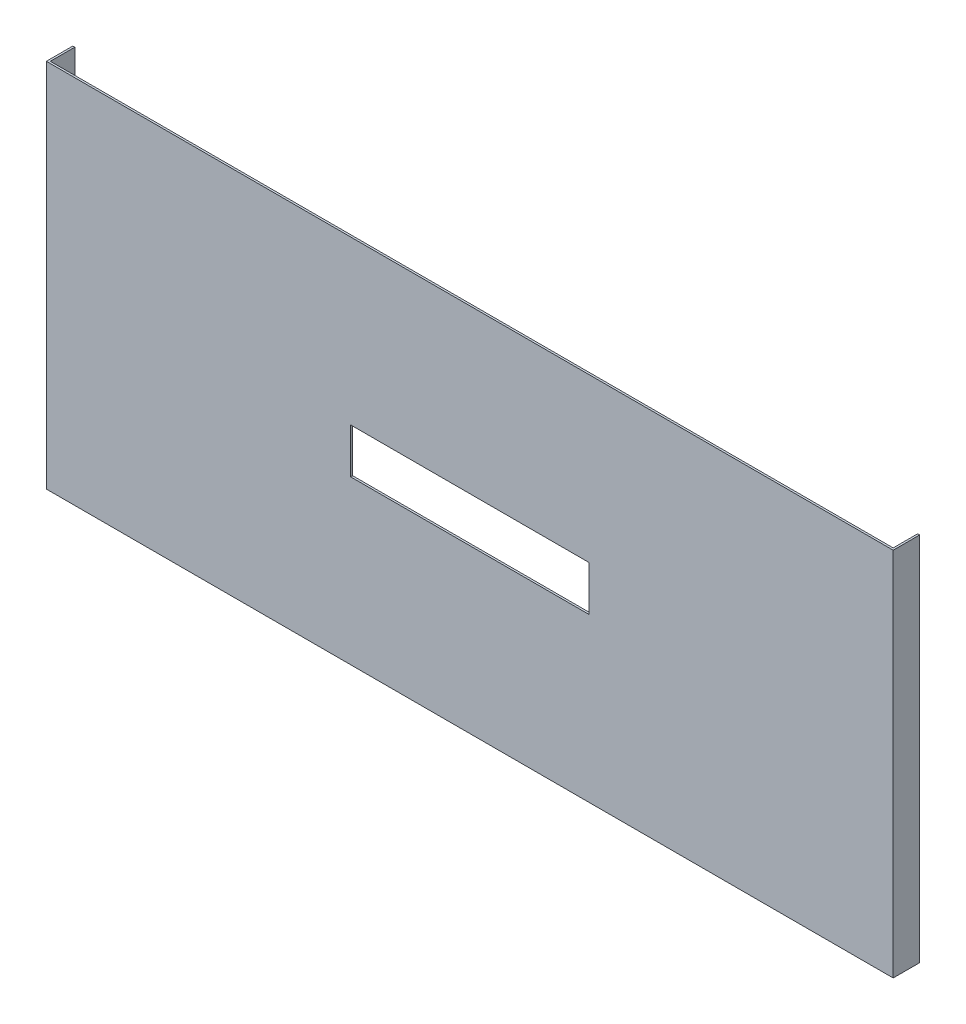
ISO-10303-21;
HEADER;
FILE_DESCRIPTION(('STEP AP214'),'2;1');
FILE_NAME('part.step','',(''),(''),'','','');
FILE_SCHEMA(('AUTOMOTIVE_DESIGN { 1 0 10303 214 1 1 1 1 }'));
ENDSEC;
DATA;
#1=APPLICATION_CONTEXT('core data for automotive mechanical design processes');
#2=APPLICATION_PROTOCOL_DEFINITION('international standard','automotive_design',2000,#1);
#3=PRODUCT_CONTEXT('',#1,'mechanical');
#4=PRODUCT('Part','Part','',(#3));
#5=PRODUCT_RELATED_PRODUCT_CATEGORY('part','',(#4));
#6=PRODUCT_DEFINITION_FORMATION('','',#4);
#7=PRODUCT_DEFINITION_CONTEXT('part definition',#1,'design');
#8=PRODUCT_DEFINITION('design','',#6,#7);
#9=PRODUCT_DEFINITION_SHAPE('','',#8);
#10=(LENGTH_UNIT() NAMED_UNIT(*) SI_UNIT(.MILLI.,.METRE.));
#11=(NAMED_UNIT(*) PLANE_ANGLE_UNIT() SI_UNIT($,.RADIAN.));
#12=(NAMED_UNIT(*) SI_UNIT($,.STERADIAN.) SOLID_ANGLE_UNIT());
#13=UNCERTAINTY_MEASURE_WITH_UNIT(LENGTH_MEASURE(1.E-05),#10,'distance_accuracy_value','');
#14=(GEOMETRIC_REPRESENTATION_CONTEXT(3) GLOBAL_UNCERTAINTY_ASSIGNED_CONTEXT((#13)) GLOBAL_UNIT_ASSIGNED_CONTEXT((#10,
#11,#12)) REPRESENTATION_CONTEXT('',''));
#15=CARTESIAN_POINT('',(0.,0.,0.));
#16=DIRECTION('',(0.,0.,1.));
#17=DIRECTION('',(1.,0.,0.));
#18=AXIS2_PLACEMENT_3D('',#15,#16,#17);
#19=CARTESIAN_POINT('',(670.,740.,40.));
#20=DIRECTION('',(0.,0.,-1.));
#21=DIRECTION('',(-1.,0.,0.));
#22=AXIS2_PLACEMENT_3D('',#19,#20,#21);
#23=PLANE('',#22);
#24=DIRECTION('',(1.,0.,0.));
#25=VECTOR('',#24,1.);
#26=CARTESIAN_POINT('',(670.,460.,40.));
#27=LINE('',#26,#25);
#28=CARTESIAN_POINT('',(30.,460.,40.));
#29=VERTEX_POINT('',#28);
#30=CARTESIAN_POINT('',(670.,460.,40.));
#31=VERTEX_POINT('',#30);
#32=EDGE_CURVE('E141',#29,#31,#27,.T.);
#33=ORIENTED_EDGE('',*,*,#32,.T.);
#34=DIRECTION('',(0.,-1.,0.));
#35=VECTOR('',#34,1.);
#36=CARTESIAN_POINT('',(670.,740.,40.));
#37=LINE('',#36,#35);
#38=CARTESIAN_POINT('',(670.,740.,40.));
#39=VERTEX_POINT('',#38);
#40=EDGE_CURVE('E200',#39,#31,#37,.T.);
#41=ORIENTED_EDGE('',*,*,#40,.F.);
#42=DIRECTION('',(1.,0.,0.));
#43=VECTOR('',#42,1.);
#44=CARTESIAN_POINT('',(670.,740.,40.));
#45=LINE('',#44,#43);
#46=CARTESIAN_POINT('',(30.,740.,40.));
#47=VERTEX_POINT('',#46);
#48=EDGE_CURVE('E149',#47,#39,#45,.T.);
#49=ORIENTED_EDGE('',*,*,#48,.F.);
#50=DIRECTION('',(0.,-1.,0.));
#51=VECTOR('',#50,1.);
#52=CARTESIAN_POINT('',(30.,740.,40.));
#53=LINE('',#52,#51);
#54=EDGE_CURVE('E166',#47,#29,#53,.T.);
#55=ORIENTED_EDGE('',*,*,#54,.T.);
#56=EDGE_LOOP('',(#33,#41,#49,#55));
#57=FACE_BOUND('',#56,.T.);
#58=DIRECTION('',(0.,-1.,0.));
#59=VECTOR('',#58,1.);
#60=CARTESIAN_POINT('',(260.,740.,40.));
#61=LINE('',#60,#59);
#62=CARTESIAN_POINT('',(260.,617.,40.));
#63=VERTEX_POINT('',#62);
#64=CARTESIAN_POINT('',(260.,583.,40.));
#65=VERTEX_POINT('',#64);
#66=EDGE_CURVE('E134',#63,#65,#61,.T.);
#67=ORIENTED_EDGE('',*,*,#66,.F.);
#68=DIRECTION('',(-1.,0.,0.));
#69=VECTOR('',#68,1.);
#70=CARTESIAN_POINT('',(670.,617.,40.));
#71=LINE('',#70,#69);
#72=CARTESIAN_POINT('',(440.,617.,40.));
#73=VERTEX_POINT('',#72);
#74=EDGE_CURVE('E123',#73,#63,#71,.T.);
#75=ORIENTED_EDGE('',*,*,#74,.F.);
#76=DIRECTION('',(0.,1.,0.));
#77=VECTOR('',#76,1.);
#78=CARTESIAN_POINT('',(440.,740.,40.));
#79=LINE('',#78,#77);
#80=CARTESIAN_POINT('',(440.,583.,40.));
#81=VERTEX_POINT('',#80);
#82=EDGE_CURVE('E128',#81,#73,#79,.T.);
#83=ORIENTED_EDGE('',*,*,#82,.F.);
#84=DIRECTION('',(1.,0.,0.));
#85=VECTOR('',#84,1.);
#86=CARTESIAN_POINT('',(670.,583.,40.));
#87=LINE('',#86,#85);
#88=EDGE_CURVE('E140',#65,#81,#87,.T.);
#89=ORIENTED_EDGE('',*,*,#88,.F.);
#90=EDGE_LOOP('',(#67,#75,#83,#89));
#91=FACE_BOUND('',#90,.T.);
#92=ADVANCED_FACE('F39',(#57,#91),#23,.F.);
#93=CARTESIAN_POINT('',(31.5,740.,38.5));
#94=DIRECTION('',(0.,0.,1.));
#95=DIRECTION('',(1.,0.,0.));
#96=AXIS2_PLACEMENT_3D('',#93,#94,#95);
#97=PLANE('',#96);
#98=DIRECTION('',(-1.,0.,0.));
#99=VECTOR('',#98,1.);
#100=CARTESIAN_POINT('',(31.5,460.,38.5));
#101=LINE('',#100,#99);
#102=CARTESIAN_POINT('',(668.5,460.,38.5));
#103=VERTEX_POINT('',#102);
#104=CARTESIAN_POINT('',(31.5,460.,38.5));
#105=VERTEX_POINT('',#104);
#106=EDGE_CURVE('E173',#103,#105,#101,.T.);
#107=ORIENTED_EDGE('',*,*,#106,.T.);
#108=DIRECTION('',(0.,-1.,0.));
#109=VECTOR('',#108,1.);
#110=CARTESIAN_POINT('',(31.5,740.,38.5));
#111=LINE('',#110,#109);
#112=CARTESIAN_POINT('',(31.5,740.,38.5));
#113=VERTEX_POINT('',#112);
#114=EDGE_CURVE('E188',#113,#105,#111,.T.);
#115=ORIENTED_EDGE('',*,*,#114,.F.);
#116=DIRECTION('',(-1.,0.,0.));
#117=VECTOR('',#116,1.);
#118=CARTESIAN_POINT('',(31.5,740.,38.5));
#119=LINE('',#118,#117);
#120=CARTESIAN_POINT('',(668.5,740.,38.5));
#121=VERTEX_POINT('',#120);
#122=EDGE_CURVE('E159',#121,#113,#119,.T.);
#123=ORIENTED_EDGE('',*,*,#122,.F.);
#124=DIRECTION('',(0.,-1.,0.));
#125=VECTOR('',#124,1.);
#126=CARTESIAN_POINT('',(668.5,740.,38.5));
#127=LINE('',#126,#125);
#128=EDGE_CURVE('E191',#121,#103,#127,.T.);
#129=ORIENTED_EDGE('',*,*,#128,.T.);
#130=EDGE_LOOP('',(#107,#115,#123,#129));
#131=FACE_BOUND('',#130,.T.);
#132=DIRECTION('',(0.,1.,0.));
#133=VECTOR('',#132,1.);
#134=CARTESIAN_POINT('',(260.,740.,38.5));
#135=LINE('',#134,#133);
#136=CARTESIAN_POINT('',(260.,583.,38.5));
#137=VERTEX_POINT('',#136);
#138=CARTESIAN_POINT('',(260.,617.,38.5));
#139=VERTEX_POINT('',#138);
#140=EDGE_CURVE('E11',#137,#139,#135,.T.);
#141=ORIENTED_EDGE('',*,*,#140,.F.);
#142=DIRECTION('',(-1.,0.,0.));
#143=VECTOR('',#142,1.);
#144=CARTESIAN_POINT('',(31.5,583.,38.5));
#145=LINE('',#144,#143);
#146=CARTESIAN_POINT('',(440.,583.,38.5));
#147=VERTEX_POINT('',#146);
#148=EDGE_CURVE('E46',#147,#137,#145,.T.);
#149=ORIENTED_EDGE('',*,*,#148,.F.);
#150=DIRECTION('',(0.,-1.,0.));
#151=VECTOR('',#150,1.);
#152=CARTESIAN_POINT('',(440.,740.,38.5));
#153=LINE('',#152,#151);
#154=CARTESIAN_POINT('',(440.,617.,38.5));
#155=VERTEX_POINT('',#154);
#156=EDGE_CURVE('E205',#155,#147,#153,.T.);
#157=ORIENTED_EDGE('',*,*,#156,.F.);
#158=DIRECTION('',(1.,0.,0.));
#159=VECTOR('',#158,1.);
#160=CARTESIAN_POINT('',(31.5,617.,38.5));
#161=LINE('',#160,#159);
#162=EDGE_CURVE('E203',#139,#155,#161,.T.);
#163=ORIENTED_EDGE('',*,*,#162,.F.);
#164=EDGE_LOOP('',(#141,#149,#157,#163));
#165=FACE_BOUND('',#164,.T.);
#166=ADVANCED_FACE('F215',(#131,#165),#97,.F.);
#167=CARTESIAN_POINT('',(670.,740.,20.));
#168=DIRECTION('',(-1.,0.,0.));
#169=DIRECTION('',(0.,0.,1.));
#170=AXIS2_PLACEMENT_3D('',#167,#168,#169);
#171=PLANE('',#170);
#172=DIRECTION('',(0.,0.,-1.));
#173=VECTOR('',#172,1.);
#174=CARTESIAN_POINT('',(670.,460.,20.));
#175=LINE('',#174,#173);
#176=CARTESIAN_POINT('',(670.,460.,20.));
#177=VERTEX_POINT('',#176);
#178=EDGE_CURVE('E144',#31,#177,#175,.T.);
#179=ORIENTED_EDGE('',*,*,#178,.T.);
#180=DIRECTION('',(0.,-1.,0.));
#181=VECTOR('',#180,1.);
#182=CARTESIAN_POINT('',(670.,740.,20.));
#183=LINE('',#182,#181);
#184=CARTESIAN_POINT('',(670.,740.,20.));
#185=VERTEX_POINT('',#184);
#186=EDGE_CURVE('E197',#185,#177,#183,.T.);
#187=ORIENTED_EDGE('',*,*,#186,.F.);
#188=DIRECTION('',(0.,0.,-1.));
#189=VECTOR('',#188,1.);
#190=CARTESIAN_POINT('',(670.,740.,20.));
#191=LINE('',#190,#189);
#192=EDGE_CURVE('E152',#39,#185,#191,.T.);
#193=ORIENTED_EDGE('',*,*,#192,.F.);
#194=ORIENTED_EDGE('',*,*,#40,.T.);
#195=EDGE_LOOP('',(#179,#187,#193,#194));
#196=FACE_BOUND('',#195,.T.);
#197=ADVANCED_FACE('F234',(#196),#171,.F.);
#198=CARTESIAN_POINT('',(668.5,740.,20.));
#199=DIRECTION('',(0.,0.,1.));
#200=DIRECTION('',(1.,0.,0.));
#201=AXIS2_PLACEMENT_3D('',#198,#199,#200);
#202=PLANE('',#201);
#203=DIRECTION('',(-1.,0.,0.));
#204=VECTOR('',#203,1.);
#205=CARTESIAN_POINT('',(668.5,460.,20.));
#206=LINE('',#205,#204);
#207=CARTESIAN_POINT('',(668.5,460.,20.));
#208=VERTEX_POINT('',#207);
#209=EDGE_CURVE('E169',#177,#208,#206,.T.);
#210=ORIENTED_EDGE('',*,*,#209,.T.);
#211=DIRECTION('',(0.,-1.,0.));
#212=VECTOR('',#211,1.);
#213=CARTESIAN_POINT('',(668.5,740.,20.));
#214=LINE('',#213,#212);
#215=CARTESIAN_POINT('',(668.5,740.,20.));
#216=VERTEX_POINT('',#215);
#217=EDGE_CURVE('E194',#216,#208,#214,.T.);
#218=ORIENTED_EDGE('',*,*,#217,.F.);
#219=DIRECTION('',(-1.,0.,0.));
#220=VECTOR('',#219,1.);
#221=CARTESIAN_POINT('',(668.5,740.,20.));
#222=LINE('',#221,#220);
#223=EDGE_CURVE('E155',#185,#216,#222,.T.);
#224=ORIENTED_EDGE('',*,*,#223,.F.);
#225=ORIENTED_EDGE('',*,*,#186,.T.);
#226=EDGE_LOOP('',(#210,#218,#224,#225));
#227=FACE_BOUND('',#226,.T.);
#228=ADVANCED_FACE('F273',(#227),#202,.F.);
#229=CARTESIAN_POINT('',(668.5,740.,38.5));
#230=DIRECTION('',(1.,0.,0.));
#231=DIRECTION('',(0.,0.,-1.));
#232=AXIS2_PLACEMENT_3D('',#229,#230,#231);
#233=PLANE('',#232);
#234=DIRECTION('',(0.,0.,1.));
#235=VECTOR('',#234,1.);
#236=CARTESIAN_POINT('',(668.5,460.,38.5));
#237=LINE('',#236,#235);
#238=EDGE_CURVE('E171',#208,#103,#237,.T.);
#239=ORIENTED_EDGE('',*,*,#238,.T.);
#240=ORIENTED_EDGE('',*,*,#128,.F.);
#241=DIRECTION('',(0.,0.,1.));
#242=VECTOR('',#241,1.);
#243=CARTESIAN_POINT('',(668.5,740.,38.5));
#244=LINE('',#243,#242);
#245=EDGE_CURVE('E157',#216,#121,#244,.T.);
#246=ORIENTED_EDGE('',*,*,#245,.F.);
#247=ORIENTED_EDGE('',*,*,#217,.T.);
#248=EDGE_LOOP('',(#239,#240,#246,#247));
#249=FACE_BOUND('',#248,.T.);
#250=ADVANCED_FACE('F270',(#249),#233,.F.);
#251=CARTESIAN_POINT('',(31.5,740.,20.));
#252=DIRECTION('',(-1.,0.,0.));
#253=DIRECTION('',(0.,0.,1.));
#254=AXIS2_PLACEMENT_3D('',#251,#252,#253);
#255=PLANE('',#254);
#256=DIRECTION('',(0.,0.,-1.));
#257=VECTOR('',#256,1.);
#258=CARTESIAN_POINT('',(31.5,460.,20.));
#259=LINE('',#258,#257);
#260=CARTESIAN_POINT('',(31.5,460.,20.));
#261=VERTEX_POINT('',#260);
#262=EDGE_CURVE('E175',#105,#261,#259,.T.);
#263=ORIENTED_EDGE('',*,*,#262,.T.);
#264=DIRECTION('',(0.,-1.,0.));
#265=VECTOR('',#264,1.);
#266=CARTESIAN_POINT('',(31.5,740.,20.));
#267=LINE('',#266,#265);
#268=CARTESIAN_POINT('',(31.5,740.,20.));
#269=VERTEX_POINT('',#268);
#270=EDGE_CURVE('E185',#269,#261,#267,.T.);
#271=ORIENTED_EDGE('',*,*,#270,.F.);
#272=DIRECTION('',(0.,0.,-1.));
#273=VECTOR('',#272,1.);
#274=CARTESIAN_POINT('',(31.5,740.,20.));
#275=LINE('',#274,#273);
#276=EDGE_CURVE('E161',#113,#269,#275,.T.);
#277=ORIENTED_EDGE('',*,*,#276,.F.);
#278=ORIENTED_EDGE('',*,*,#114,.T.);
#279=EDGE_LOOP('',(#263,#271,#277,#278));
#280=FACE_BOUND('',#279,.T.);
#281=ADVANCED_FACE('F263',(#280),#255,.F.);
#282=CARTESIAN_POINT('',(30.,740.,20.));
#283=DIRECTION('',(0.,0.,1.));
#284=DIRECTION('',(1.,0.,0.));
#285=AXIS2_PLACEMENT_3D('',#282,#283,#284);
#286=PLANE('',#285);
#287=DIRECTION('',(-1.,0.,0.));
#288=VECTOR('',#287,1.);
#289=CARTESIAN_POINT('',(30.,460.,20.));
#290=LINE('',#289,#288);
#291=CARTESIAN_POINT('',(30.,460.,20.));
#292=VERTEX_POINT('',#291);
#293=EDGE_CURVE('E177',#261,#292,#290,.T.);
#294=ORIENTED_EDGE('',*,*,#293,.T.);
#295=DIRECTION('',(0.,-1.,0.));
#296=VECTOR('',#295,1.);
#297=CARTESIAN_POINT('',(30.,740.,20.));
#298=LINE('',#297,#296);
#299=CARTESIAN_POINT('',(30.,740.,20.));
#300=VERTEX_POINT('',#299);
#301=EDGE_CURVE('E182',#300,#292,#298,.T.);
#302=ORIENTED_EDGE('',*,*,#301,.F.);
#303=DIRECTION('',(-1.,0.,0.));
#304=VECTOR('',#303,1.);
#305=CARTESIAN_POINT('',(30.,740.,20.));
#306=LINE('',#305,#304);
#307=EDGE_CURVE('E163',#269,#300,#306,.T.);
#308=ORIENTED_EDGE('',*,*,#307,.F.);
#309=ORIENTED_EDGE('',*,*,#270,.T.);
#310=EDGE_LOOP('',(#294,#302,#308,#309));
#311=FACE_BOUND('',#310,.T.);
#312=ADVANCED_FACE('F258',(#311),#286,.F.);
#313=CARTESIAN_POINT('',(30.,740.,40.));
#314=DIRECTION('',(1.,0.,0.));
#315=DIRECTION('',(0.,0.,-1.));
#316=AXIS2_PLACEMENT_3D('',#313,#314,#315);
#317=PLANE('',#316);
#318=DIRECTION('',(0.,0.,1.));
#319=VECTOR('',#318,1.);
#320=CARTESIAN_POINT('',(30.,460.,40.));
#321=LINE('',#320,#319);
#322=EDGE_CURVE('E153',#292,#29,#321,.T.);
#323=ORIENTED_EDGE('',*,*,#322,.T.);
#324=ORIENTED_EDGE('',*,*,#54,.F.);
#325=DIRECTION('',(0.,0.,1.));
#326=VECTOR('',#325,1.);
#327=CARTESIAN_POINT('',(30.,740.,40.));
#328=LINE('',#327,#326);
#329=EDGE_CURVE('E165',#300,#47,#328,.T.);
#330=ORIENTED_EDGE('',*,*,#329,.F.);
#331=ORIENTED_EDGE('',*,*,#301,.T.);
#332=EDGE_LOOP('',(#323,#324,#330,#331));
#333=FACE_BOUND('',#332,.T.);
#334=ADVANCED_FACE('F256',(#333),#317,.F.);
#335=CARTESIAN_POINT('',(0.,740.,0.));
#336=DIRECTION('',(0.,-1.,0.));
#337=DIRECTION('',(0.,0.,-1.));
#338=AXIS2_PLACEMENT_3D('',#335,#336,#337);
#339=PLANE('',#338);
#340=ORIENTED_EDGE('',*,*,#48,.T.);
#341=ORIENTED_EDGE('',*,*,#192,.T.);
#342=ORIENTED_EDGE('',*,*,#223,.T.);
#343=ORIENTED_EDGE('',*,*,#245,.T.);
#344=ORIENTED_EDGE('',*,*,#122,.T.);
#345=ORIENTED_EDGE('',*,*,#276,.T.);
#346=ORIENTED_EDGE('',*,*,#307,.T.);
#347=ORIENTED_EDGE('',*,*,#329,.T.);
#348=EDGE_LOOP('',(#340,#341,#342,#343,#344,#345,#346,#347));
#349=FACE_BOUND('',#348,.T.);
#350=ADVANCED_FACE('F251',(#349),#339,.F.);
#351=CARTESIAN_POINT('',(0.,460.,0.));
#352=DIRECTION('',(0.,-1.,0.));
#353=DIRECTION('',(0.,0.,-1.));
#354=AXIS2_PLACEMENT_3D('',#351,#352,#353);
#355=PLANE('',#354);
#356=ORIENTED_EDGE('',*,*,#32,.F.);
#357=ORIENTED_EDGE('',*,*,#322,.F.);
#358=ORIENTED_EDGE('',*,*,#293,.F.);
#359=ORIENTED_EDGE('',*,*,#262,.F.);
#360=ORIENTED_EDGE('',*,*,#106,.F.);
#361=ORIENTED_EDGE('',*,*,#238,.F.);
#362=ORIENTED_EDGE('',*,*,#209,.F.);
#363=ORIENTED_EDGE('',*,*,#178,.F.);
#364=EDGE_LOOP('',(#356,#357,#358,#359,#360,#361,#362,#363));
#365=FACE_BOUND('',#364,.T.);
#366=ADVANCED_FACE('F243',(#365),#355,.T.);
#367=CARTESIAN_POINT('',(260.,583.,41.));
#368=DIRECTION('',(1.,0.,0.));
#369=DIRECTION('',(0.,0.,-1.));
#370=AXIS2_PLACEMENT_3D('',#367,#368,#369);
#371=PLANE('',#370);
#372=ORIENTED_EDGE('',*,*,#66,.T.);
#373=DIRECTION('',(0.,0.,-1.));
#374=VECTOR('',#373,1.);
#375=CARTESIAN_POINT('',(260.,583.,41.));
#376=LINE('',#375,#374);
#377=EDGE_CURVE('E129',#65,#137,#376,.T.);
#378=ORIENTED_EDGE('',*,*,#377,.T.);
#379=ORIENTED_EDGE('',*,*,#140,.T.);
#380=DIRECTION('',(0.,0.,-1.));
#381=VECTOR('',#380,1.);
#382=CARTESIAN_POINT('',(260.,617.,41.));
#383=LINE('',#382,#381);
#384=EDGE_CURVE('E58',#63,#139,#383,.T.);
#385=ORIENTED_EDGE('',*,*,#384,.F.);
#386=EDGE_LOOP('',(#372,#378,#379,#385));
#387=FACE_BOUND('',#386,.T.);
#388=ADVANCED_FACE('F132',(#387),#371,.T.);
#389=CARTESIAN_POINT('',(260.,583.,41.));
#390=DIRECTION('',(0.,1.,0.));
#391=DIRECTION('',(0.,0.,1.));
#392=AXIS2_PLACEMENT_3D('',#389,#390,#391);
#393=PLANE('',#392);
#394=ORIENTED_EDGE('',*,*,#88,.T.);
#395=DIRECTION('',(0.,0.,-1.));
#396=VECTOR('',#395,1.);
#397=CARTESIAN_POINT('',(440.,583.,41.));
#398=LINE('',#397,#396);
#399=EDGE_CURVE('E211',#81,#147,#398,.T.);
#400=ORIENTED_EDGE('',*,*,#399,.T.);
#401=ORIENTED_EDGE('',*,*,#148,.T.);
#402=ORIENTED_EDGE('',*,*,#377,.F.);
#403=EDGE_LOOP('',(#394,#400,#401,#402));
#404=FACE_BOUND('',#403,.T.);
#405=ADVANCED_FACE('F209',(#404),#393,.T.);
#406=CARTESIAN_POINT('',(440.,583.,41.));
#407=DIRECTION('',(-1.,0.,0.));
#408=DIRECTION('',(0.,0.,1.));
#409=AXIS2_PLACEMENT_3D('',#406,#407,#408);
#410=PLANE('',#409);
#411=ORIENTED_EDGE('',*,*,#82,.T.);
#412=DIRECTION('',(0.,0.,-1.));
#413=VECTOR('',#412,1.);
#414=CARTESIAN_POINT('',(440.,617.,41.));
#415=LINE('',#414,#413);
#416=EDGE_CURVE('E53',#73,#155,#415,.T.);
#417=ORIENTED_EDGE('',*,*,#416,.T.);
#418=ORIENTED_EDGE('',*,*,#156,.T.);
#419=ORIENTED_EDGE('',*,*,#399,.F.);
#420=EDGE_LOOP('',(#411,#417,#418,#419));
#421=FACE_BOUND('',#420,.T.);
#422=ADVANCED_FACE('F217',(#421),#410,.T.);
#423=CARTESIAN_POINT('',(260.,617.,41.));
#424=DIRECTION('',(0.,-1.,0.));
#425=DIRECTION('',(0.,0.,-1.));
#426=AXIS2_PLACEMENT_3D('',#423,#424,#425);
#427=PLANE('',#426);
#428=ORIENTED_EDGE('',*,*,#74,.T.);
#429=ORIENTED_EDGE('',*,*,#384,.T.);
#430=ORIENTED_EDGE('',*,*,#162,.T.);
#431=ORIENTED_EDGE('',*,*,#416,.F.);
#432=EDGE_LOOP('',(#428,#429,#430,#431));
#433=FACE_BOUND('',#432,.T.);
#434=ADVANCED_FACE('F124',(#433),#427,.T.);
#435=CLOSED_SHELL('',(#92,#166,#197,#228,#250,#281,#312,#334,#350,#366,#388,#405,#422,#434));
#436=MANIFOLD_SOLID_BREP('B2',#435);
#437=ADVANCED_BREP_SHAPE_REPRESENTATION('',(#18,#436),#14);
#438=SHAPE_DEFINITION_REPRESENTATION(#9,#437);
ENDSEC;
END-ISO-10303-21;
